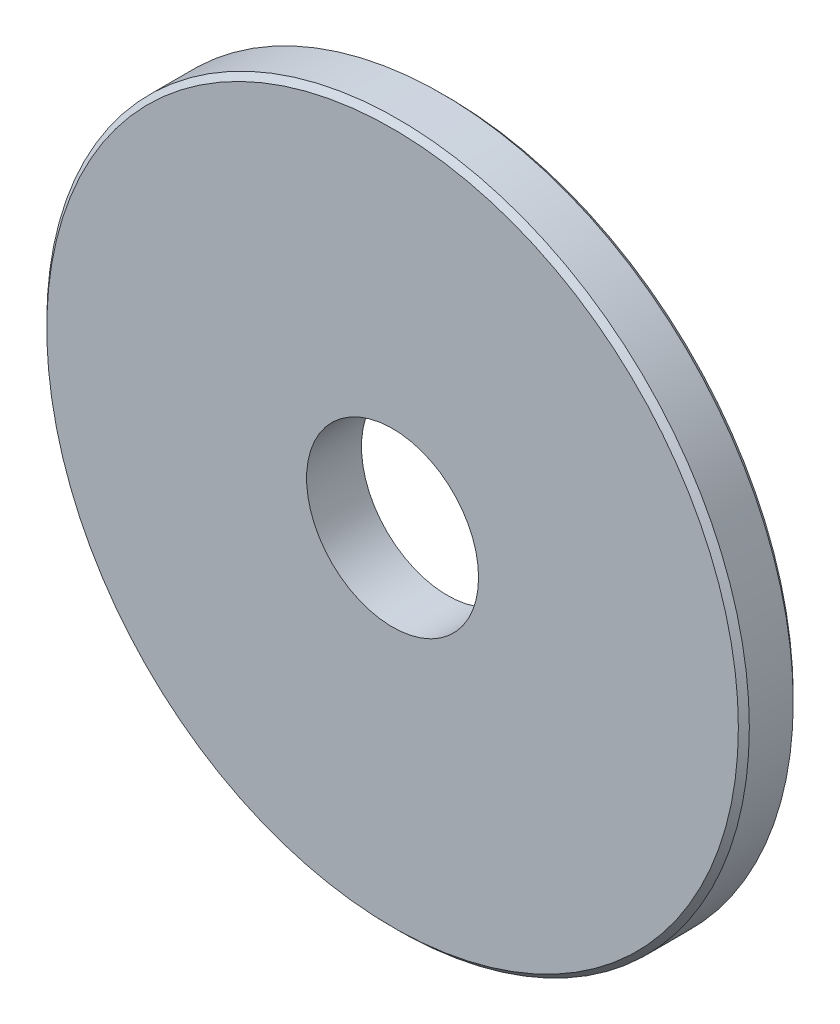
ISO-10303-21;
HEADER;
FILE_DESCRIPTION(('STEP AP214'),'2;1');
FILE_NAME('part.step','',(''),(''),'','','');
FILE_SCHEMA(('AUTOMOTIVE_DESIGN { 1 0 10303 214 1 1 1 1 }'));
ENDSEC;
DATA;
#1=APPLICATION_CONTEXT('core data for automotive mechanical design processes');
#2=APPLICATION_PROTOCOL_DEFINITION('international standard','automotive_design',2000,#1);
#3=PRODUCT_CONTEXT('',#1,'mechanical');
#4=PRODUCT('Part','Part','',(#3));
#5=PRODUCT_RELATED_PRODUCT_CATEGORY('part','',(#4));
#6=PRODUCT_DEFINITION_FORMATION('','',#4);
#7=PRODUCT_DEFINITION_CONTEXT('part definition',#1,'design');
#8=PRODUCT_DEFINITION('design','',#6,#7);
#9=PRODUCT_DEFINITION_SHAPE('','',#8);
#10=(LENGTH_UNIT() NAMED_UNIT(*) SI_UNIT(.MILLI.,.METRE.));
#11=(NAMED_UNIT(*) PLANE_ANGLE_UNIT() SI_UNIT($,.RADIAN.));
#12=(NAMED_UNIT(*) SI_UNIT($,.STERADIAN.) SOLID_ANGLE_UNIT());
#13=UNCERTAINTY_MEASURE_WITH_UNIT(LENGTH_MEASURE(1.E-05),#10,'distance_accuracy_value','');
#14=(GEOMETRIC_REPRESENTATION_CONTEXT(3) GLOBAL_UNCERTAINTY_ASSIGNED_CONTEXT((#13)) GLOBAL_UNIT_ASSIGNED_CONTEXT((#10,
#11,#12)) REPRESENTATION_CONTEXT('',''));
#15=CARTESIAN_POINT('',(0.,0.,0.));
#16=DIRECTION('',(0.,0.,1.));
#17=DIRECTION('',(1.,0.,0.));
#18=AXIS2_PLACEMENT_3D('',#15,#16,#17);
#19=CARTESIAN_POINT('',(0.,0.,10.));
#20=DIRECTION('',(0.,0.,1.));
#21=DIRECTION('',(1.,0.,0.));
#22=AXIS2_PLACEMENT_3D('',#19,#20,#21);
#23=PLANE('',#22);
#24=CARTESIAN_POINT('',(0.,0.,10.));
#25=DIRECTION('',(0.,0.,1.));
#26=DIRECTION('',(1.,0.,0.));
#27=AXIS2_PLACEMENT_3D('',#24,#25,#26);
#28=CIRCLE('',#27,63.0160170990155);
#29=CARTESIAN_POINT('',(63.0160170990155,0.,10.));
#30=VERTEX_POINT('',#29);
#31=EDGE_CURVE('E10',#30,#30,#28,.T.);
#32=ORIENTED_EDGE('',*,*,#31,.T.);
#33=EDGE_LOOP('',(#32));
#34=FACE_BOUND('',#33,.T.);
#35=CARTESIAN_POINT('',(0.,0.,10.));
#36=DIRECTION('',(0.,0.,1.));
#37=DIRECTION('',(1.,0.,0.));
#38=AXIS2_PLACEMENT_3D('',#35,#36,#37);
#39=CIRCLE('',#38,15.6725684698439);
#40=CARTESIAN_POINT('',(15.6725684698439,0.,10.));
#41=VERTEX_POINT('',#40);
#42=EDGE_CURVE('E69',#41,#41,#39,.T.);
#43=ORIENTED_EDGE('',*,*,#42,.F.);
#44=EDGE_LOOP('',(#43));
#45=FACE_BOUND('',#44,.T.);
#46=ADVANCED_FACE('F44',(#34,#45),#23,.T.);
#47=CARTESIAN_POINT('',(0.,0.,0.));
#48=DIRECTION('',(0.,0.,1.));
#49=DIRECTION('',(1.,0.,0.));
#50=AXIS2_PLACEMENT_3D('',#47,#48,#49);
#51=PLANE('',#50);
#52=CARTESIAN_POINT('',(0.,0.,0.));
#53=DIRECTION('',(0.,0.,1.));
#54=DIRECTION('',(1.,0.,0.));
#55=AXIS2_PLACEMENT_3D('',#52,#53,#54);
#56=CIRCLE('',#55,63.0160170990155);
#57=CARTESIAN_POINT('',(63.0160170990155,0.,0.));
#58=VERTEX_POINT('',#57);
#59=EDGE_CURVE('E53',#58,#58,#56,.F.);
#60=ORIENTED_EDGE('',*,*,#59,.T.);
#61=EDGE_LOOP('',(#60));
#62=FACE_BOUND('',#61,.T.);
#63=CARTESIAN_POINT('',(0.,0.,0.));
#64=DIRECTION('',(0.,0.,1.));
#65=DIRECTION('',(1.,0.,0.));
#66=AXIS2_PLACEMENT_3D('',#63,#64,#65);
#67=CIRCLE('',#66,15.6725684698439);
#68=CARTESIAN_POINT('',(15.6725684698439,0.,0.));
#69=VERTEX_POINT('',#68);
#70=EDGE_CURVE('E70',#69,#69,#67,.T.);
#71=ORIENTED_EDGE('',*,*,#70,.T.);
#72=EDGE_LOOP('',(#71));
#73=FACE_BOUND('',#72,.T.);
#74=ADVANCED_FACE('F82',(#62,#73),#51,.F.);
#75=CARTESIAN_POINT('',(0.,0.,10.));
#76=DIRECTION('',(0.,0.,-1.));
#77=DIRECTION('',(-1.,0.,0.));
#78=AXIS2_PLACEMENT_3D('',#75,#76,#77);
#79=CYLINDRICAL_SURFACE('',#78,64.0160170990154);
#80=CARTESIAN_POINT('',(0.,0.,0.999999999999987));
#81=DIRECTION('',(0.,0.,1.));
#82=DIRECTION('',(1.,0.,0.));
#83=AXIS2_PLACEMENT_3D('',#80,#81,#82);
#84=CIRCLE('',#83,64.0160170990154);
#85=CARTESIAN_POINT('',(64.0160170990154,0.,0.999999999999987));
#86=VERTEX_POINT('',#85);
#87=EDGE_CURVE('E58',#86,#86,#84,.T.);
#88=ORIENTED_EDGE('',*,*,#87,.T.);
#89=EDGE_LOOP('',(#88));
#90=FACE_BOUND('',#89,.T.);
#91=CARTESIAN_POINT('',(0.,0.,9.00000000000006));
#92=DIRECTION('',(0.,0.,1.));
#93=DIRECTION('',(1.,0.,0.));
#94=AXIS2_PLACEMENT_3D('',#91,#92,#93);
#95=CIRCLE('',#94,64.0160170990154);
#96=CARTESIAN_POINT('',(64.0160170990154,0.,9.00000000000006));
#97=VERTEX_POINT('',#96);
#98=EDGE_CURVE('E63',#97,#97,#95,.F.);
#99=ORIENTED_EDGE('',*,*,#98,.T.);
#100=EDGE_LOOP('',(#99));
#101=FACE_BOUND('',#100,.T.);
#102=ADVANCED_FACE('F88',(#90,#101),#79,.T.);
#103=CARTESIAN_POINT('',(0.,0.,10.));
#104=DIRECTION('',(0.,0.,-1.));
#105=DIRECTION('',(-1.,0.,0.));
#106=AXIS2_PLACEMENT_3D('',#103,#104,#105);
#107=CYLINDRICAL_SURFACE('',#106,15.6725684698439);
#108=ORIENTED_EDGE('',*,*,#42,.T.);
#109=EDGE_LOOP('',(#108));
#110=FACE_BOUND('',#109,.T.);
#111=ORIENTED_EDGE('',*,*,#70,.F.);
#112=EDGE_LOOP('',(#111));
#113=FACE_BOUND('',#112,.T.);
#114=ADVANCED_FACE('F78',(#110,#113),#107,.F.);
#115=CARTESIAN_POINT('',(0.,0.,0.999999999999987));
#116=DIRECTION('',(0.,0.,1.));
#117=DIRECTION('',(1.,0.,0.));
#118=AXIS2_PLACEMENT_3D('',#115,#116,#117);
#119=CONICAL_SURFACE('',#118,64.0160170990154,0.785398163397448);
#120=ORIENTED_EDGE('',*,*,#59,.F.);
#121=EDGE_LOOP('',(#120));
#122=FACE_BOUND('',#121,.T.);
#123=ORIENTED_EDGE('',*,*,#87,.F.);
#124=EDGE_LOOP('',(#123));
#125=FACE_BOUND('',#124,.T.);
#126=ADVANCED_FACE('F95',(#122,#125),#119,.T.);
#127=CARTESIAN_POINT('',(0.,0.,10.));
#128=DIRECTION('',(0.,0.,-1.));
#129=DIRECTION('',(-1.,0.,0.));
#130=AXIS2_PLACEMENT_3D('',#127,#128,#129);
#131=CONICAL_SURFACE('',#130,63.0160170990155,0.785398163397462);
#132=ORIENTED_EDGE('',*,*,#98,.F.);
#133=EDGE_LOOP('',(#132));
#134=FACE_BOUND('',#133,.T.);
#135=ORIENTED_EDGE('',*,*,#31,.F.);
#136=EDGE_LOOP('',(#135));
#137=FACE_BOUND('',#136,.T.);
#138=ADVANCED_FACE('F47',(#134,#137),#131,.T.);
#139=CLOSED_SHELL('',(#46,#74,#102,#114,#126,#138));
#140=MANIFOLD_SOLID_BREP('B2',#139);
#141=ADVANCED_BREP_SHAPE_REPRESENTATION('',(#18,#140),#14);
#142=SHAPE_DEFINITION_REPRESENTATION(#9,#141);
ENDSEC;
END-ISO-10303-21;
